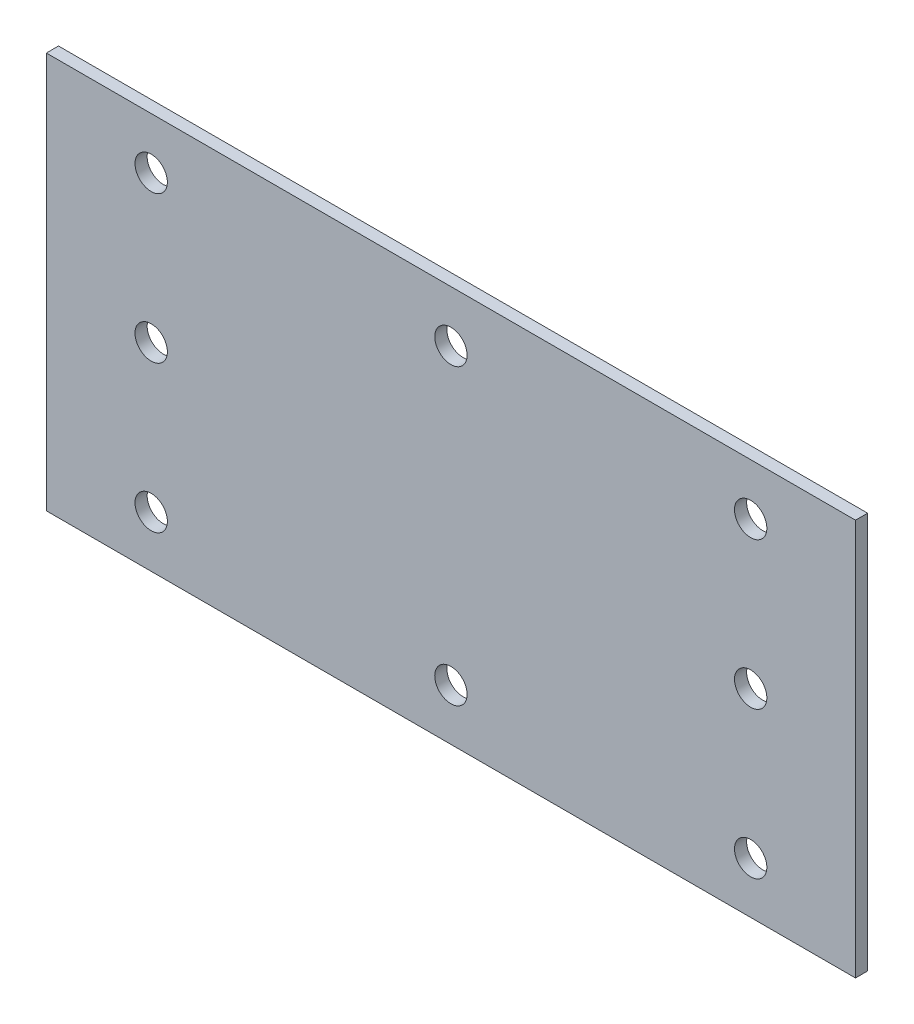
ISO-10303-21;
HEADER;
FILE_DESCRIPTION(('STEP AP214'),'2;1');
FILE_NAME('part.step','',(''),(''),'','','');
FILE_SCHEMA(('AUTOMOTIVE_DESIGN { 1 0 10303 214 1 1 1 1 }'));
ENDSEC;
DATA;
#1=APPLICATION_CONTEXT('core data for automotive mechanical design processes');
#2=APPLICATION_PROTOCOL_DEFINITION('international standard','automotive_design',2000,#1);
#3=PRODUCT_CONTEXT('',#1,'mechanical');
#4=PRODUCT('Part','Part','',(#3));
#5=PRODUCT_RELATED_PRODUCT_CATEGORY('part','',(#4));
#6=PRODUCT_DEFINITION_FORMATION('','',#4);
#7=PRODUCT_DEFINITION_CONTEXT('part definition',#1,'design');
#8=PRODUCT_DEFINITION('design','',#6,#7);
#9=PRODUCT_DEFINITION_SHAPE('','',#8);
#10=(LENGTH_UNIT() NAMED_UNIT(*) SI_UNIT(.MILLI.,.METRE.));
#11=(NAMED_UNIT(*) PLANE_ANGLE_UNIT() SI_UNIT($,.RADIAN.));
#12=(NAMED_UNIT(*) SI_UNIT($,.STERADIAN.) SOLID_ANGLE_UNIT());
#13=UNCERTAINTY_MEASURE_WITH_UNIT(LENGTH_MEASURE(1.E-05),#10,'distance_accuracy_value','');
#14=(GEOMETRIC_REPRESENTATION_CONTEXT(3) GLOBAL_UNCERTAINTY_ASSIGNED_CONTEXT((#13)) GLOBAL_UNIT_ASSIGNED_CONTEXT((#10,
#11,#12)) REPRESENTATION_CONTEXT('',''));
#15=CARTESIAN_POINT('',(0.,0.,0.));
#16=DIRECTION('',(0.,0.,1.));
#17=DIRECTION('',(1.,0.,0.));
#18=AXIS2_PLACEMENT_3D('',#15,#16,#17);
#19=CARTESIAN_POINT('',(0.,0.,3.));
#20=DIRECTION('',(0.,0.,1.));
#21=DIRECTION('',(1.,0.,0.));
#22=AXIS2_PLACEMENT_3D('',#19,#20,#21);
#23=PLANE('',#22);
#24=CARTESIAN_POINT('',(-26.4057971014492,51.9253321085606,3.));
#25=DIRECTION('',(0.,0.,1.));
#26=DIRECTION('',(1.,0.,0.));
#27=AXIS2_PLACEMENT_3D('',#24,#25,#26);
#28=CIRCLE('',#27,4.);
#29=CARTESIAN_POINT('',(-22.4057971014492,51.9253321085606,3.));
#30=VERTEX_POINT('',#29);
#31=EDGE_CURVE('E153',#30,#30,#28,.T.);
#32=ORIENTED_EDGE('',*,*,#31,.F.);
#33=EDGE_LOOP('',(#32));
#34=FACE_BOUND('',#33,.T.);
#35=CARTESIAN_POINT('',(-100.49180465811,15.6231884057971,3.));
#36=DIRECTION('',(0.,0.,1.));
#37=DIRECTION('',(1.,0.,0.));
#38=AXIS2_PLACEMENT_3D('',#35,#36,#37);
#39=CIRCLE('',#38,4.00000000000001);
#40=CARTESIAN_POINT('',(-96.4918046581096,15.6231884057971,3.));
#41=VERTEX_POINT('',#40);
#42=EDGE_CURVE('E141',#41,#41,#39,.T.);
#43=ORIENTED_EDGE('',*,*,#42,.F.);
#44=EDGE_LOOP('',(#43));
#45=FACE_BOUND('',#44,.T.);
#46=CARTESIAN_POINT('',(-100.49180465811,-20.6789552969665,3.));
#47=DIRECTION('',(0.,0.,1.));
#48=DIRECTION('',(1.,0.,0.));
#49=AXIS2_PLACEMENT_3D('',#46,#47,#48);
#50=CIRCLE('',#49,4.00000000000001);
#51=CARTESIAN_POINT('',(-96.4918046581096,-20.6789552969665,3.));
#52=VERTEX_POINT('',#51);
#53=EDGE_CURVE('E129',#52,#52,#50,.T.);
#54=ORIENTED_EDGE('',*,*,#53,.F.);
#55=EDGE_LOOP('',(#54));
#56=FACE_BOUND('',#55,.T.);
#57=CARTESIAN_POINT('',(47.6802104552111,51.9253321085606,3.));
#58=DIRECTION('',(0.,0.,1.));
#59=DIRECTION('',(1.,0.,0.));
#60=AXIS2_PLACEMENT_3D('',#57,#58,#59);
#61=CIRCLE('',#60,4.00000000000001);
#62=CARTESIAN_POINT('',(51.6802104552111,51.9253321085606,3.));
#63=VERTEX_POINT('',#62);
#64=EDGE_CURVE('E108',#63,#63,#61,.T.);
#65=ORIENTED_EDGE('',*,*,#64,.F.);
#66=EDGE_LOOP('',(#65));
#67=FACE_BOUND('',#66,.T.);
#68=DIRECTION('',(0.,-1.,0.));
#69=VECTOR('',#68,1.);
#70=CARTESIAN_POINT('',(-126.405797101449,64.6231884057971,3.));
#71=LINE('',#70,#69);
#72=CARTESIAN_POINT('',(-126.405797101449,64.6231884057971,3.));
#73=VERTEX_POINT('',#72);
#74=CARTESIAN_POINT('',(-126.405797101449,-33.3768115942029,3.));
#75=VERTEX_POINT('',#74);
#76=EDGE_CURVE('E93',#73,#75,#71,.T.);
#77=ORIENTED_EDGE('',*,*,#76,.T.);
#78=DIRECTION('',(1.,0.,0.));
#79=VECTOR('',#78,1.);
#80=CARTESIAN_POINT('',(-126.405797101449,-33.3768115942029,3.));
#81=LINE('',#80,#79);
#82=CARTESIAN_POINT('',(73.5942028985508,-33.3768115942029,3.));
#83=VERTEX_POINT('',#82);
#84=EDGE_CURVE('E88',#75,#83,#81,.T.);
#85=ORIENTED_EDGE('',*,*,#84,.T.);
#86=DIRECTION('',(0.,1.,0.));
#87=VECTOR('',#86,1.);
#88=CARTESIAN_POINT('',(73.5942028985508,64.6231884057971,3.));
#89=LINE('',#88,#87);
#90=CARTESIAN_POINT('',(73.5942028985508,64.6231884057971,3.));
#91=VERTEX_POINT('',#90);
#92=EDGE_CURVE('E91',#83,#91,#89,.T.);
#93=ORIENTED_EDGE('',*,*,#92,.T.);
#94=DIRECTION('',(-1.,0.,0.));
#95=VECTOR('',#94,1.);
#96=CARTESIAN_POINT('',(-126.405797101449,64.6231884057971,3.));
#97=LINE('',#96,#95);
#98=EDGE_CURVE('E58',#91,#73,#97,.T.);
#99=ORIENTED_EDGE('',*,*,#98,.T.);
#100=EDGE_LOOP('',(#77,#85,#93,#99));
#101=FACE_BOUND('',#100,.T.);
#102=CARTESIAN_POINT('',(-100.49180465811,51.9253321085606,3.));
#103=DIRECTION('',(0.,0.,1.));
#104=DIRECTION('',(-1.,0.,0.));
#105=AXIS2_PLACEMENT_3D('',#102,#103,#104);
#106=CIRCLE('',#105,4.00000000000001);
#107=CARTESIAN_POINT('',(-104.49180465811,51.9253321085606,3.));
#108=VERTEX_POINT('',#107);
#109=EDGE_CURVE('E123',#108,#108,#106,.T.);
#110=ORIENTED_EDGE('',*,*,#109,.F.);
#111=EDGE_LOOP('',(#110));
#112=FACE_BOUND('',#111,.T.);
#113=CARTESIAN_POINT('',(47.6802104552111,-20.6789552969665,3.));
#114=DIRECTION('',(0.,0.,1.));
#115=DIRECTION('',(-1.,0.,0.));
#116=AXIS2_PLACEMENT_3D('',#113,#114,#115);
#117=CIRCLE('',#116,4.00000000000001);
#118=CARTESIAN_POINT('',(43.6802104552111,-20.6789552969665,3.));
#119=VERTEX_POINT('',#118);
#120=EDGE_CURVE('E135',#119,#119,#117,.T.);
#121=ORIENTED_EDGE('',*,*,#120,.F.);
#122=EDGE_LOOP('',(#121));
#123=FACE_BOUND('',#122,.T.);
#124=CARTESIAN_POINT('',(47.6802104552111,15.6231884057971,3.));
#125=DIRECTION('',(0.,0.,1.));
#126=DIRECTION('',(-1.,0.,0.));
#127=AXIS2_PLACEMENT_3D('',#124,#125,#126);
#128=CIRCLE('',#127,4.00000000000001);
#129=CARTESIAN_POINT('',(43.6802104552111,15.6231884057971,3.));
#130=VERTEX_POINT('',#129);
#131=EDGE_CURVE('E147',#130,#130,#128,.T.);
#132=ORIENTED_EDGE('',*,*,#131,.F.);
#133=EDGE_LOOP('',(#132));
#134=FACE_BOUND('',#133,.T.);
#135=CARTESIAN_POINT('',(-26.4057971014492,-20.6789552969665,3.));
#136=DIRECTION('',(0.,0.,1.));
#137=DIRECTION('',(-1.,0.,0.));
#138=AXIS2_PLACEMENT_3D('',#135,#136,#137);
#139=CIRCLE('',#138,4.);
#140=CARTESIAN_POINT('',(-30.4057971014492,-20.6789552969665,3.));
#141=VERTEX_POINT('',#140);
#142=EDGE_CURVE('E159',#141,#141,#139,.T.);
#143=ORIENTED_EDGE('',*,*,#142,.F.);
#144=EDGE_LOOP('',(#143));
#145=FACE_BOUND('',#144,.T.);
#146=ADVANCED_FACE('F41',(#34,#45,#56,#67,#101,#112,#123,#134,#145),#23,.T.);
#147=CARTESIAN_POINT('',(0.,0.,0.));
#148=DIRECTION('',(0.,0.,1.));
#149=DIRECTION('',(1.,0.,0.));
#150=AXIS2_PLACEMENT_3D('',#147,#148,#149);
#151=PLANE('',#150);
#152=DIRECTION('',(0.,-1.,0.));
#153=VECTOR('',#152,1.);
#154=CARTESIAN_POINT('',(-126.405797101449,64.6231884057971,0.));
#155=LINE('',#154,#153);
#156=CARTESIAN_POINT('',(-126.405797101449,64.6231884057971,0.));
#157=VERTEX_POINT('',#156);
#158=CARTESIAN_POINT('',(-126.405797101449,-33.3768115942029,0.));
#159=VERTEX_POINT('',#158);
#160=EDGE_CURVE('E105',#157,#159,#155,.T.);
#161=ORIENTED_EDGE('',*,*,#160,.F.);
#162=DIRECTION('',(-1.,0.,0.));
#163=VECTOR('',#162,1.);
#164=CARTESIAN_POINT('',(-126.405797101449,64.6231884057971,0.));
#165=LINE('',#164,#163);
#166=CARTESIAN_POINT('',(73.5942028985508,64.6231884057971,0.));
#167=VERTEX_POINT('',#166);
#168=EDGE_CURVE('E81',#167,#157,#165,.T.);
#169=ORIENTED_EDGE('',*,*,#168,.F.);
#170=DIRECTION('',(0.,1.,0.));
#171=VECTOR('',#170,1.);
#172=CARTESIAN_POINT('',(73.5942028985508,64.6231884057971,0.));
#173=LINE('',#172,#171);
#174=CARTESIAN_POINT('',(73.5942028985508,-33.3768115942029,0.));
#175=VERTEX_POINT('',#174);
#176=EDGE_CURVE('E75',#175,#167,#173,.T.);
#177=ORIENTED_EDGE('',*,*,#176,.F.);
#178=DIRECTION('',(1.,0.,0.));
#179=VECTOR('',#178,1.);
#180=CARTESIAN_POINT('',(-126.405797101449,-33.3768115942029,0.));
#181=LINE('',#180,#179);
#182=EDGE_CURVE('E97',#159,#175,#181,.T.);
#183=ORIENTED_EDGE('',*,*,#182,.F.);
#184=EDGE_LOOP('',(#161,#169,#177,#183));
#185=FACE_BOUND('',#184,.T.);
#186=CARTESIAN_POINT('',(47.6802104552111,51.9253321085606,0.));
#187=DIRECTION('',(0.,0.,1.));
#188=DIRECTION('',(1.,0.,0.));
#189=AXIS2_PLACEMENT_3D('',#186,#187,#188);
#190=CIRCLE('',#189,4.00000000000001);
#191=CARTESIAN_POINT('',(51.6802104552111,51.9253321085606,0.));
#192=VERTEX_POINT('',#191);
#193=EDGE_CURVE('E120',#192,#192,#190,.T.);
#194=ORIENTED_EDGE('',*,*,#193,.T.);
#195=EDGE_LOOP('',(#194));
#196=FACE_BOUND('',#195,.T.);
#197=CARTESIAN_POINT('',(-100.49180465811,51.9253321085606,0.));
#198=DIRECTION('',(0.,0.,1.));
#199=DIRECTION('',(-1.,0.,0.));
#200=AXIS2_PLACEMENT_3D('',#197,#198,#199);
#201=CIRCLE('',#200,4.00000000000001);
#202=CARTESIAN_POINT('',(-104.49180465811,51.9253321085606,0.));
#203=VERTEX_POINT('',#202);
#204=EDGE_CURVE('E126',#203,#203,#201,.T.);
#205=ORIENTED_EDGE('',*,*,#204,.T.);
#206=EDGE_LOOP('',(#205));
#207=FACE_BOUND('',#206,.T.);
#208=CARTESIAN_POINT('',(-100.49180465811,-20.6789552969665,0.));
#209=DIRECTION('',(0.,0.,1.));
#210=DIRECTION('',(1.,0.,0.));
#211=AXIS2_PLACEMENT_3D('',#208,#209,#210);
#212=CIRCLE('',#211,4.00000000000001);
#213=CARTESIAN_POINT('',(-96.4918046581096,-20.6789552969665,0.));
#214=VERTEX_POINT('',#213);
#215=EDGE_CURVE('E132',#214,#214,#212,.T.);
#216=ORIENTED_EDGE('',*,*,#215,.T.);
#217=EDGE_LOOP('',(#216));
#218=FACE_BOUND('',#217,.T.);
#219=CARTESIAN_POINT('',(47.6802104552111,-20.6789552969665,0.));
#220=DIRECTION('',(0.,0.,1.));
#221=DIRECTION('',(-1.,0.,0.));
#222=AXIS2_PLACEMENT_3D('',#219,#220,#221);
#223=CIRCLE('',#222,4.00000000000001);
#224=CARTESIAN_POINT('',(43.6802104552111,-20.6789552969665,0.));
#225=VERTEX_POINT('',#224);
#226=EDGE_CURVE('E138',#225,#225,#223,.T.);
#227=ORIENTED_EDGE('',*,*,#226,.T.);
#228=EDGE_LOOP('',(#227));
#229=FACE_BOUND('',#228,.T.);
#230=CARTESIAN_POINT('',(-100.49180465811,15.6231884057971,0.));
#231=DIRECTION('',(0.,0.,1.));
#232=DIRECTION('',(1.,0.,0.));
#233=AXIS2_PLACEMENT_3D('',#230,#231,#232);
#234=CIRCLE('',#233,4.00000000000001);
#235=CARTESIAN_POINT('',(-96.4918046581096,15.6231884057971,0.));
#236=VERTEX_POINT('',#235);
#237=EDGE_CURVE('E144',#236,#236,#234,.T.);
#238=ORIENTED_EDGE('',*,*,#237,.T.);
#239=EDGE_LOOP('',(#238));
#240=FACE_BOUND('',#239,.T.);
#241=CARTESIAN_POINT('',(47.6802104552111,15.6231884057971,0.));
#242=DIRECTION('',(0.,0.,1.));
#243=DIRECTION('',(-1.,0.,0.));
#244=AXIS2_PLACEMENT_3D('',#241,#242,#243);
#245=CIRCLE('',#244,4.00000000000001);
#246=CARTESIAN_POINT('',(43.6802104552111,15.6231884057971,0.));
#247=VERTEX_POINT('',#246);
#248=EDGE_CURVE('E150',#247,#247,#245,.T.);
#249=ORIENTED_EDGE('',*,*,#248,.T.);
#250=EDGE_LOOP('',(#249));
#251=FACE_BOUND('',#250,.T.);
#252=CARTESIAN_POINT('',(-26.4057971014492,51.9253321085606,0.));
#253=DIRECTION('',(0.,0.,1.));
#254=DIRECTION('',(1.,0.,0.));
#255=AXIS2_PLACEMENT_3D('',#252,#253,#254);
#256=CIRCLE('',#255,4.);
#257=CARTESIAN_POINT('',(-22.4057971014492,51.9253321085606,0.));
#258=VERTEX_POINT('',#257);
#259=EDGE_CURVE('E156',#258,#258,#256,.T.);
#260=ORIENTED_EDGE('',*,*,#259,.T.);
#261=EDGE_LOOP('',(#260));
#262=FACE_BOUND('',#261,.T.);
#263=CARTESIAN_POINT('',(-26.4057971014492,-20.6789552969665,0.));
#264=DIRECTION('',(0.,0.,1.));
#265=DIRECTION('',(-1.,0.,0.));
#266=AXIS2_PLACEMENT_3D('',#263,#264,#265);
#267=CIRCLE('',#266,4.);
#268=CARTESIAN_POINT('',(-30.4057971014492,-20.6789552969665,0.));
#269=VERTEX_POINT('',#268);
#270=EDGE_CURVE('E162',#269,#269,#267,.T.);
#271=ORIENTED_EDGE('',*,*,#270,.T.);
#272=EDGE_LOOP('',(#271));
#273=FACE_BOUND('',#272,.T.);
#274=ADVANCED_FACE('F116',(#185,#196,#207,#218,#229,#240,#251,#262,#273),#151,.F.);
#275=CARTESIAN_POINT('',(-126.405797101449,64.6231884057971,3.));
#276=DIRECTION('',(1.,0.,0.));
#277=DIRECTION('',(0.,0.,-1.));
#278=AXIS2_PLACEMENT_3D('',#275,#276,#277);
#279=PLANE('',#278);
#280=ORIENTED_EDGE('',*,*,#160,.T.);
#281=DIRECTION('',(0.,0.,-1.));
#282=VECTOR('',#281,1.);
#283=CARTESIAN_POINT('',(-126.405797101449,-33.3768115942029,3.));
#284=LINE('',#283,#282);
#285=EDGE_CURVE('E11',#75,#159,#284,.T.);
#286=ORIENTED_EDGE('',*,*,#285,.F.);
#287=ORIENTED_EDGE('',*,*,#76,.F.);
#288=DIRECTION('',(0.,0.,-1.));
#289=VECTOR('',#288,1.);
#290=CARTESIAN_POINT('',(-126.405797101449,64.6231884057971,3.));
#291=LINE('',#290,#289);
#292=EDGE_CURVE('E101',#73,#157,#291,.T.);
#293=ORIENTED_EDGE('',*,*,#292,.T.);
#294=EDGE_LOOP('',(#280,#286,#287,#293));
#295=FACE_BOUND('',#294,.T.);
#296=ADVANCED_FACE('F43',(#295),#279,.F.);
#297=CARTESIAN_POINT('',(-126.405797101449,-33.3768115942029,3.));
#298=DIRECTION('',(0.,1.,0.));
#299=DIRECTION('',(-1.,0.,0.));
#300=AXIS2_PLACEMENT_3D('',#297,#298,#299);
#301=PLANE('',#300);
#302=ORIENTED_EDGE('',*,*,#182,.T.);
#303=DIRECTION('',(0.,0.,-1.));
#304=VECTOR('',#303,1.);
#305=CARTESIAN_POINT('',(73.5942028985508,-33.3768115942029,3.));
#306=LINE('',#305,#304);
#307=EDGE_CURVE('E50',#83,#175,#306,.T.);
#308=ORIENTED_EDGE('',*,*,#307,.F.);
#309=ORIENTED_EDGE('',*,*,#84,.F.);
#310=ORIENTED_EDGE('',*,*,#285,.T.);
#311=EDGE_LOOP('',(#302,#308,#309,#310));
#312=FACE_BOUND('',#311,.T.);
#313=ADVANCED_FACE('F96',(#312),#301,.F.);
#314=CARTESIAN_POINT('',(73.5942028985508,64.6231884057971,3.));
#315=DIRECTION('',(-1.,0.,0.));
#316=DIRECTION('',(0.,0.,1.));
#317=AXIS2_PLACEMENT_3D('',#314,#315,#316);
#318=PLANE('',#317);
#319=ORIENTED_EDGE('',*,*,#176,.T.);
#320=DIRECTION('',(0.,0.,-1.));
#321=VECTOR('',#320,1.);
#322=CARTESIAN_POINT('',(73.5942028985508,64.6231884057971,3.));
#323=LINE('',#322,#321);
#324=EDGE_CURVE('E98',#91,#167,#323,.T.);
#325=ORIENTED_EDGE('',*,*,#324,.F.);
#326=ORIENTED_EDGE('',*,*,#92,.F.);
#327=ORIENTED_EDGE('',*,*,#307,.T.);
#328=EDGE_LOOP('',(#319,#325,#326,#327));
#329=FACE_BOUND('',#328,.T.);
#330=ADVANCED_FACE('F99',(#329),#318,.F.);
#331=CARTESIAN_POINT('',(-126.405797101449,64.6231884057971,3.));
#332=DIRECTION('',(0.,-1.,0.));
#333=DIRECTION('',(0.,0.,-1.));
#334=AXIS2_PLACEMENT_3D('',#331,#332,#333);
#335=PLANE('',#334);
#336=ORIENTED_EDGE('',*,*,#168,.T.);
#337=ORIENTED_EDGE('',*,*,#292,.F.);
#338=ORIENTED_EDGE('',*,*,#98,.F.);
#339=ORIENTED_EDGE('',*,*,#324,.T.);
#340=EDGE_LOOP('',(#336,#337,#338,#339));
#341=FACE_BOUND('',#340,.T.);
#342=ADVANCED_FACE('F113',(#341),#335,.F.);
#343=CARTESIAN_POINT('',(47.6802104552111,51.9253321085606,3.));
#344=DIRECTION('',(0.,0.,-1.));
#345=DIRECTION('',(-1.,0.,0.));
#346=AXIS2_PLACEMENT_3D('',#343,#344,#345);
#347=CYLINDRICAL_SURFACE('',#346,4.00000000000001);
#348=ORIENTED_EDGE('',*,*,#64,.T.);
#349=EDGE_LOOP('',(#348));
#350=FACE_BOUND('',#349,.T.);
#351=ORIENTED_EDGE('',*,*,#193,.F.);
#352=EDGE_LOOP('',(#351));
#353=FACE_BOUND('',#352,.T.);
#354=ADVANCED_FACE('F181',(#350,#353),#347,.F.);
#355=CARTESIAN_POINT('',(-100.49180465811,51.9253321085606,3.));
#356=DIRECTION('',(0.,0.,-1.));
#357=DIRECTION('',(-1.,0.,0.));
#358=AXIS2_PLACEMENT_3D('',#355,#356,#357);
#359=CYLINDRICAL_SURFACE('',#358,4.00000000000001);
#360=ORIENTED_EDGE('',*,*,#109,.T.);
#361=EDGE_LOOP('',(#360));
#362=FACE_BOUND('',#361,.T.);
#363=ORIENTED_EDGE('',*,*,#204,.F.);
#364=EDGE_LOOP('',(#363));
#365=FACE_BOUND('',#364,.T.);
#366=ADVANCED_FACE('F226',(#362,#365),#359,.F.);
#367=CARTESIAN_POINT('',(-100.49180465811,-20.6789552969665,3.));
#368=DIRECTION('',(0.,0.,-1.));
#369=DIRECTION('',(-1.,0.,0.));
#370=AXIS2_PLACEMENT_3D('',#367,#368,#369);
#371=CYLINDRICAL_SURFACE('',#370,4.00000000000001);
#372=ORIENTED_EDGE('',*,*,#53,.T.);
#373=EDGE_LOOP('',(#372));
#374=FACE_BOUND('',#373,.T.);
#375=ORIENTED_EDGE('',*,*,#215,.F.);
#376=EDGE_LOOP('',(#375));
#377=FACE_BOUND('',#376,.T.);
#378=ADVANCED_FACE('F234',(#374,#377),#371,.F.);
#379=CARTESIAN_POINT('',(47.6802104552111,-20.6789552969665,3.));
#380=DIRECTION('',(0.,0.,-1.));
#381=DIRECTION('',(-1.,0.,0.));
#382=AXIS2_PLACEMENT_3D('',#379,#380,#381);
#383=CYLINDRICAL_SURFACE('',#382,4.00000000000001);
#384=ORIENTED_EDGE('',*,*,#120,.T.);
#385=EDGE_LOOP('',(#384));
#386=FACE_BOUND('',#385,.T.);
#387=ORIENTED_EDGE('',*,*,#226,.F.);
#388=EDGE_LOOP('',(#387));
#389=FACE_BOUND('',#388,.T.);
#390=ADVANCED_FACE('F242',(#386,#389),#383,.F.);
#391=CARTESIAN_POINT('',(-100.49180465811,15.6231884057971,3.));
#392=DIRECTION('',(0.,0.,-1.));
#393=DIRECTION('',(-1.,0.,0.));
#394=AXIS2_PLACEMENT_3D('',#391,#392,#393);
#395=CYLINDRICAL_SURFACE('',#394,4.00000000000001);
#396=ORIENTED_EDGE('',*,*,#42,.T.);
#397=EDGE_LOOP('',(#396));
#398=FACE_BOUND('',#397,.T.);
#399=ORIENTED_EDGE('',*,*,#237,.F.);
#400=EDGE_LOOP('',(#399));
#401=FACE_BOUND('',#400,.T.);
#402=ADVANCED_FACE('F251',(#398,#401),#395,.F.);
#403=CARTESIAN_POINT('',(47.6802104552111,15.6231884057971,3.));
#404=DIRECTION('',(0.,0.,-1.));
#405=DIRECTION('',(-1.,0.,0.));
#406=AXIS2_PLACEMENT_3D('',#403,#404,#405);
#407=CYLINDRICAL_SURFACE('',#406,4.00000000000001);
#408=ORIENTED_EDGE('',*,*,#131,.T.);
#409=EDGE_LOOP('',(#408));
#410=FACE_BOUND('',#409,.T.);
#411=ORIENTED_EDGE('',*,*,#248,.F.);
#412=EDGE_LOOP('',(#411));
#413=FACE_BOUND('',#412,.T.);
#414=ADVANCED_FACE('F260',(#410,#413),#407,.F.);
#415=CARTESIAN_POINT('',(-26.4057971014492,51.9253321085606,3.));
#416=DIRECTION('',(0.,0.,-1.));
#417=DIRECTION('',(-1.,0.,0.));
#418=AXIS2_PLACEMENT_3D('',#415,#416,#417);
#419=CYLINDRICAL_SURFACE('',#418,4.);
#420=ORIENTED_EDGE('',*,*,#31,.T.);
#421=EDGE_LOOP('',(#420));
#422=FACE_BOUND('',#421,.T.);
#423=ORIENTED_EDGE('',*,*,#259,.F.);
#424=EDGE_LOOP('',(#423));
#425=FACE_BOUND('',#424,.T.);
#426=ADVANCED_FACE('F269',(#422,#425),#419,.F.);
#427=CARTESIAN_POINT('',(-26.4057971014492,-20.6789552969665,3.));
#428=DIRECTION('',(0.,0.,-1.));
#429=DIRECTION('',(-1.,0.,0.));
#430=AXIS2_PLACEMENT_3D('',#427,#428,#429);
#431=CYLINDRICAL_SURFACE('',#430,4.);
#432=ORIENTED_EDGE('',*,*,#142,.T.);
#433=EDGE_LOOP('',(#432));
#434=FACE_BOUND('',#433,.T.);
#435=ORIENTED_EDGE('',*,*,#270,.F.);
#436=EDGE_LOOP('',(#435));
#437=FACE_BOUND('',#436,.T.);
#438=ADVANCED_FACE('F168',(#434,#437),#431,.F.);
#439=CLOSED_SHELL('',(#146,#274,#296,#313,#330,#342,#354,#366,#378,#390,#402,#414,#426,#438));
#440=MANIFOLD_SOLID_BREP('B2',#439);
#441=ADVANCED_BREP_SHAPE_REPRESENTATION('',(#18,#440),#14);
#442=SHAPE_DEFINITION_REPRESENTATION(#9,#441);
ENDSEC;
END-ISO-10303-21;
